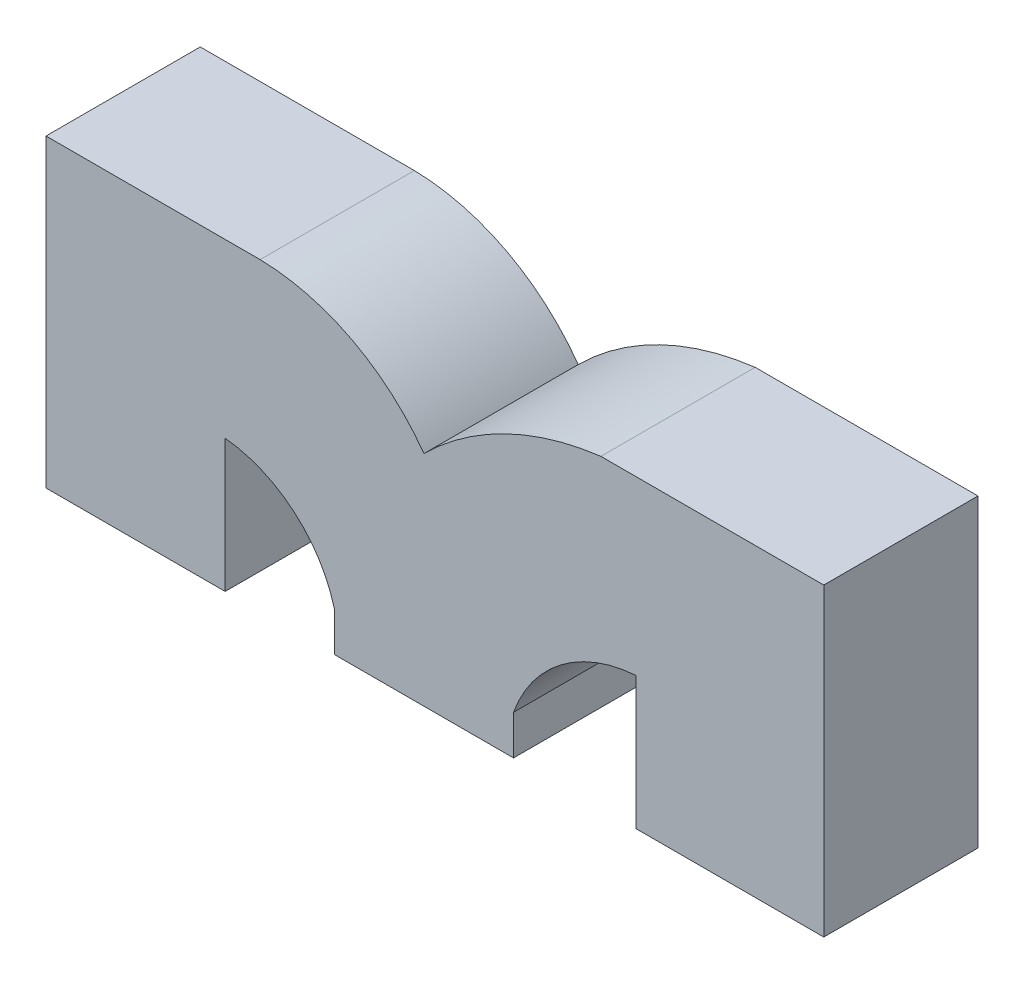
ISO-10303-21;
HEADER;
FILE_DESCRIPTION(('STEP AP214'),'2;1');
FILE_NAME('part.step','',(''),(''),'','','');
FILE_SCHEMA(('AUTOMOTIVE_DESIGN { 1 0 10303 214 1 1 1 1 }'));
ENDSEC;
DATA;
#1=APPLICATION_CONTEXT('core data for automotive mechanical design processes');
#2=APPLICATION_PROTOCOL_DEFINITION('international standard','automotive_design',2000,#1);
#3=PRODUCT_CONTEXT('',#1,'mechanical');
#4=PRODUCT('Part','Part','',(#3));
#5=PRODUCT_RELATED_PRODUCT_CATEGORY('part','',(#4));
#6=PRODUCT_DEFINITION_FORMATION('','',#4);
#7=PRODUCT_DEFINITION_CONTEXT('part definition',#1,'design');
#8=PRODUCT_DEFINITION('design','',#6,#7);
#9=PRODUCT_DEFINITION_SHAPE('','',#8);
#10=(LENGTH_UNIT() NAMED_UNIT(*) SI_UNIT(.MILLI.,.METRE.));
#11=(NAMED_UNIT(*) PLANE_ANGLE_UNIT() SI_UNIT($,.RADIAN.));
#12=(NAMED_UNIT(*) SI_UNIT($,.STERADIAN.) SOLID_ANGLE_UNIT());
#13=UNCERTAINTY_MEASURE_WITH_UNIT(LENGTH_MEASURE(1.E-05),#10,'distance_accuracy_value','');
#14=(GEOMETRIC_REPRESENTATION_CONTEXT(3) GLOBAL_UNCERTAINTY_ASSIGNED_CONTEXT((#13)) GLOBAL_UNIT_ASSIGNED_CONTEXT((#10,
#11,#12)) REPRESENTATION_CONTEXT('',''));
#15=CARTESIAN_POINT('',(0.,0.,0.));
#16=DIRECTION('',(0.,0.,1.));
#17=DIRECTION('',(1.,0.,0.));
#18=AXIS2_PLACEMENT_3D('',#15,#16,#17);
#19=CARTESIAN_POINT('',(-26.128211751492,6.131404155787,0.));
#20=DIRECTION('',(-1.,0.,0.));
#21=DIRECTION('',(0.,-1.,0.));
#22=AXIS2_PLACEMENT_3D('',#19,#20,#21);
#23=PLANE('',#22);
#24=DIRECTION('',(0.,-1.,0.));
#25=VECTOR('',#24,1.);
#26=CARTESIAN_POINT('',(-26.128211751492,6.131404155787,0.));
#27=LINE('',#26,#25);
#28=CARTESIAN_POINT('',(-26.128211751492,6.131404155787,0.));
#29=VERTEX_POINT('',#28);
#30=CARTESIAN_POINT('',(-26.128211751492,6.105766226117,0.));
#31=VERTEX_POINT('',#30);
#32=EDGE_CURVE('E11',#29,#31,#27,.T.);
#33=ORIENTED_EDGE('',*,*,#32,.T.);
#34=DIRECTION('',(0.,0.,1.));
#35=VECTOR('',#34,1.);
#36=CARTESIAN_POINT('',(-26.128211751492,6.105766226117,0.));
#37=LINE('',#36,#35);
#38=CARTESIAN_POINT('',(-26.128211751492,6.105766226117,0.1));
#39=VERTEX_POINT('',#38);
#40=EDGE_CURVE('E24',#31,#39,#37,.T.);
#41=ORIENTED_EDGE('',*,*,#40,.T.);
#42=DIRECTION('',(0.,-1.,0.));
#43=VECTOR('',#42,1.);
#44=CARTESIAN_POINT('',(-26.128211751492,6.131404155787,0.1));
#45=LINE('',#44,#43);
#46=CARTESIAN_POINT('',(-26.128211751492,6.131404155787,0.1));
#47=VERTEX_POINT('',#46);
#48=EDGE_CURVE('E142',#47,#39,#45,.T.);
#49=ORIENTED_EDGE('',*,*,#48,.F.);
#50=DIRECTION('',(0.,0.,1.));
#51=VECTOR('',#50,1.);
#52=CARTESIAN_POINT('',(-26.128211751492,6.131404155787,0.));
#53=LINE('',#52,#51);
#54=EDGE_CURVE('E250',#29,#47,#53,.T.);
#55=ORIENTED_EDGE('',*,*,#54,.F.);
#56=EDGE_LOOP('',(#33,#41,#49,#55));
#57=FACE_BOUND('',#56,.T.);
#58=ADVANCED_FACE('F17',(#57),#23,.T.);
#59=CARTESIAN_POINT('',(-26.207252238582,6.11043659046,0.));
#60=DIRECTION('',(0.,0.,1.));
#61=DIRECTION('',(-0.96656871015664,-0.256407738857723,0.));
#62=AXIS2_PLACEMENT_3D('',#59,#60,#61);
#63=CYLINDRICAL_SURFACE('',#62,0.0817743076716421);
#64=CARTESIAN_POINT('',(-26.207252238582,6.11043659046,0.));
#65=DIRECTION('',(0.,0.,-1.));
#66=DIRECTION('',(-0.96656871015664,-0.256407738857723,0.));
#67=AXIS2_PLACEMENT_3D('',#64,#65,#66);
#68=CIRCLE('',#67,0.0817743076716421);
#69=CARTESIAN_POINT('',(-26.199029290648,6.191796411763,0.));
#70=VERTEX_POINT('',#69);
#71=EDGE_CURVE('E247',#70,#29,#68,.T.);
#72=ORIENTED_EDGE('',*,*,#71,.T.);
#73=ORIENTED_EDGE('',*,*,#54,.T.);
#74=CARTESIAN_POINT('',(-26.207252238582,6.11043659046,0.1));
#75=DIRECTION('',(0.,0.,-1.));
#76=DIRECTION('',(-0.96656871015664,-0.256407738857723,0.));
#77=AXIS2_PLACEMENT_3D('',#74,#75,#76);
#78=CIRCLE('',#77,0.0817743076716421);
#79=CARTESIAN_POINT('',(-26.199029290648,6.191796411763,0.1));
#80=VERTEX_POINT('',#79);
#81=EDGE_CURVE('E245',#80,#47,#78,.T.);
#82=ORIENTED_EDGE('',*,*,#81,.F.);
#83=DIRECTION('',(0.,0.,1.));
#84=VECTOR('',#83,1.);
#85=CARTESIAN_POINT('',(-26.199029290648,6.191796411763,0.));
#86=LINE('',#85,#84);
#87=EDGE_CURVE('E243',#70,#80,#86,.T.);
#88=ORIENTED_EDGE('',*,*,#87,.F.);
#89=EDGE_LOOP('',(#72,#73,#82,#88));
#90=FACE_BOUND('',#89,.T.);
#91=ADVANCED_FACE('F289',(#90),#63,.F.);
#92=CARTESIAN_POINT('',(-26.199029290648,6.105766226117,0.));
#93=DIRECTION('',(1.,0.,0.));
#94=DIRECTION('',(0.,1.,0.));
#95=AXIS2_PLACEMENT_3D('',#92,#93,#94);
#96=PLANE('',#95);
#97=DIRECTION('',(0.,1.,0.));
#98=VECTOR('',#97,1.);
#99=CARTESIAN_POINT('',(-26.199029290648,6.105766226117,0.));
#100=LINE('',#99,#98);
#101=CARTESIAN_POINT('',(-26.199029290648,6.105766226117,0.));
#102=VERTEX_POINT('',#101);
#103=EDGE_CURVE('E240',#102,#70,#100,.T.);
#104=ORIENTED_EDGE('',*,*,#103,.T.);
#105=ORIENTED_EDGE('',*,*,#87,.T.);
#106=DIRECTION('',(0.,1.,0.));
#107=VECTOR('',#106,1.);
#108=CARTESIAN_POINT('',(-26.199029290648,6.105766226117,0.1));
#109=LINE('',#108,#107);
#110=CARTESIAN_POINT('',(-26.199029290648,6.105766226117,0.1));
#111=VERTEX_POINT('',#110);
#112=EDGE_CURVE('E237',#111,#80,#109,.T.);
#113=ORIENTED_EDGE('',*,*,#112,.F.);
#114=DIRECTION('',(0.,0.,1.));
#115=VECTOR('',#114,1.);
#116=CARTESIAN_POINT('',(-26.199029290648,6.105766226117,0.));
#117=LINE('',#116,#115);
#118=EDGE_CURVE('E234',#102,#111,#117,.T.);
#119=ORIENTED_EDGE('',*,*,#118,.F.);
#120=EDGE_LOOP('',(#104,#105,#113,#119));
#121=FACE_BOUND('',#120,.T.);
#122=ADVANCED_FACE('F287',(#121),#96,.T.);
#123=CARTESIAN_POINT('',(-26.315170054864,6.105766226117,0.));
#124=DIRECTION('',(0.,-1.,0.));
#125=DIRECTION('',(1.,0.,0.));
#126=AXIS2_PLACEMENT_3D('',#123,#124,#125);
#127=PLANE('',#126);
#128=DIRECTION('',(1.,0.,0.));
#129=VECTOR('',#128,1.);
#130=CARTESIAN_POINT('',(-26.315170054864,6.105766226117,0.));
#131=LINE('',#130,#129);
#132=CARTESIAN_POINT('',(-26.315170054864,6.105766226117,0.));
#133=VERTEX_POINT('',#132);
#134=EDGE_CURVE('E231',#133,#102,#131,.T.);
#135=ORIENTED_EDGE('',*,*,#134,.T.);
#136=ORIENTED_EDGE('',*,*,#118,.T.);
#137=DIRECTION('',(1.,0.,0.));
#138=VECTOR('',#137,1.);
#139=CARTESIAN_POINT('',(-26.315170054864,6.105766226117,0.1));
#140=LINE('',#139,#138);
#141=CARTESIAN_POINT('',(-26.315170054864,6.105766226117,0.1));
#142=VERTEX_POINT('',#141);
#143=EDGE_CURVE('E228',#142,#111,#140,.T.);
#144=ORIENTED_EDGE('',*,*,#143,.F.);
#145=DIRECTION('',(0.,0.,1.));
#146=VECTOR('',#145,1.);
#147=CARTESIAN_POINT('',(-26.315170054864,6.105766226117,0.));
#148=LINE('',#147,#146);
#149=EDGE_CURVE('E225',#133,#142,#148,.T.);
#150=ORIENTED_EDGE('',*,*,#149,.F.);
#151=EDGE_LOOP('',(#135,#136,#144,#150));
#152=FACE_BOUND('',#151,.T.);
#153=ADVANCED_FACE('F283',(#152),#127,.T.);
#154=CARTESIAN_POINT('',(-26.315170054864,6.30342142889,0.));
#155=DIRECTION('',(-1.,0.,0.));
#156=DIRECTION('',(0.,-1.,0.));
#157=AXIS2_PLACEMENT_3D('',#154,#155,#156);
#158=PLANE('',#157);
#159=DIRECTION('',(0.,-1.,0.));
#160=VECTOR('',#159,1.);
#161=CARTESIAN_POINT('',(-26.315170054864,6.30342142889,0.));
#162=LINE('',#161,#160);
#163=CARTESIAN_POINT('',(-26.315170054864,6.30342142889,0.));
#164=VERTEX_POINT('',#163);
#165=EDGE_CURVE('E222',#164,#133,#162,.T.);
#166=ORIENTED_EDGE('',*,*,#165,.T.);
#167=ORIENTED_EDGE('',*,*,#149,.T.);
#168=DIRECTION('',(0.,-1.,0.));
#169=VECTOR('',#168,1.);
#170=CARTESIAN_POINT('',(-26.315170054864,6.30342142889,0.1));
#171=LINE('',#170,#169);
#172=CARTESIAN_POINT('',(-26.315170054864,6.30342142889,0.1));
#173=VERTEX_POINT('',#172);
#174=EDGE_CURVE('E219',#173,#142,#171,.T.);
#175=ORIENTED_EDGE('',*,*,#174,.F.);
#176=DIRECTION('',(0.,0.,1.));
#177=VECTOR('',#176,1.);
#178=CARTESIAN_POINT('',(-26.315170054864,6.30342142889,0.));
#179=LINE('',#178,#177);
#180=EDGE_CURVE('E216',#164,#173,#179,.T.);
#181=ORIENTED_EDGE('',*,*,#180,.F.);
#182=EDGE_LOOP('',(#166,#167,#175,#181));
#183=FACE_BOUND('',#182,.T.);
#184=ADVANCED_FACE('F280',(#183),#158,.T.);
#185=CARTESIAN_POINT('',(-26.176367678118,6.30342142889,0.));
#186=DIRECTION('',(0.,1.,0.));
#187=DIRECTION('',(-1.,0.,0.));
#188=AXIS2_PLACEMENT_3D('',#185,#186,#187);
#189=PLANE('',#188);
#190=DIRECTION('',(-1.,0.,0.));
#191=VECTOR('',#190,1.);
#192=CARTESIAN_POINT('',(-26.176367678118,6.30342142889,0.));
#193=LINE('',#192,#191);
#194=CARTESIAN_POINT('',(-26.176367678118,6.30342142889,0.));
#195=VERTEX_POINT('',#194);
#196=EDGE_CURVE('E213',#195,#164,#193,.T.);
#197=ORIENTED_EDGE('',*,*,#196,.T.);
#198=ORIENTED_EDGE('',*,*,#180,.T.);
#199=DIRECTION('',(-1.,0.,0.));
#200=VECTOR('',#199,1.);
#201=CARTESIAN_POINT('',(-26.176367678118,6.30342142889,0.1));
#202=LINE('',#201,#200);
#203=CARTESIAN_POINT('',(-26.176367678118,6.30342142889,0.1));
#204=VERTEX_POINT('',#203);
#205=EDGE_CURVE('E210',#204,#173,#202,.T.);
#206=ORIENTED_EDGE('',*,*,#205,.F.);
#207=DIRECTION('',(0.,0.,1.));
#208=VECTOR('',#207,1.);
#209=CARTESIAN_POINT('',(-26.176367678118,6.30342142889,0.));
#210=LINE('',#209,#208);
#211=EDGE_CURVE('E207',#195,#204,#210,.T.);
#212=ORIENTED_EDGE('',*,*,#211,.F.);
#213=EDGE_LOOP('',(#197,#198,#206,#212));
#214=FACE_BOUND('',#213,.T.);
#215=ADVANCED_FACE('F277',(#214),#189,.T.);
#216=CARTESIAN_POINT('',(-26.178825059013,6.169749406555,0.));
#217=DIRECTION('',(0.,0.,1.));
#218=DIRECTION('',(0.812925001603613,0.582368390082915,0.));
#219=AXIS2_PLACEMENT_3D('',#216,#217,#218);
#220=CYLINDRICAL_SURFACE('',#219,0.133694608253058);
#221=CARTESIAN_POINT('',(-26.178825059013,6.169749406555,0.));
#222=DIRECTION('',(0.,0.,1.));
#223=DIRECTION('',(0.812925001603613,0.582368390082915,0.));
#224=AXIS2_PLACEMENT_3D('',#221,#222,#223);
#225=CIRCLE('',#224,0.133694608253058);
#226=CARTESIAN_POINT('',(-26.070141369385,6.247608920327,0.));
#227=VERTEX_POINT('',#226);
#228=EDGE_CURVE('E204',#227,#195,#225,.T.);
#229=ORIENTED_EDGE('',*,*,#228,.T.);
#230=ORIENTED_EDGE('',*,*,#211,.T.);
#231=CARTESIAN_POINT('',(-26.178825059013,6.169749406555,0.1));
#232=DIRECTION('',(0.,0.,1.));
#233=DIRECTION('',(0.812925001603613,0.582368390082915,0.));
#234=AXIS2_PLACEMENT_3D('',#231,#232,#233);
#235=CIRCLE('',#234,0.133694608253058);
#236=CARTESIAN_POINT('',(-26.070141369385,6.247608920327,0.1));
#237=VERTEX_POINT('',#236);
#238=EDGE_CURVE('E201',#237,#204,#235,.T.);
#239=ORIENTED_EDGE('',*,*,#238,.F.);
#240=DIRECTION('',(0.,0.,1.));
#241=VECTOR('',#240,1.);
#242=CARTESIAN_POINT('',(-26.070141369385,6.247608920327,0.));
#243=LINE('',#242,#241);
#244=EDGE_CURVE('E198',#227,#237,#243,.T.);
#245=ORIENTED_EDGE('',*,*,#244,.F.);
#246=EDGE_LOOP('',(#229,#230,#239,#245));
#247=FACE_BOUND('',#246,.T.);
#248=ADVANCED_FACE('F274',(#247),#220,.T.);
#249=CARTESIAN_POINT('',(-25.931506084624,6.108455738535,0.));
#250=DIRECTION('',(0.,0.,1.));
#251=DIRECTION('',(-0.121729387015494,0.992563326109137,0.));
#252=AXIS2_PLACEMENT_3D('',#249,#250,#251);
#253=CYLINDRICAL_SURFACE('',#252,0.196426449806513);
#254=CARTESIAN_POINT('',(-25.931506084624,6.108455738535,0.));
#255=DIRECTION('',(0.,0.,1.));
#256=DIRECTION('',(-0.121729387015494,0.992563326109137,0.));
#257=AXIS2_PLACEMENT_3D('',#254,#255,#256);
#258=CIRCLE('',#257,0.196426449806513);
#259=CARTESIAN_POINT('',(-25.955416955952,6.30342142889,0.));
#260=VERTEX_POINT('',#259);
#261=EDGE_CURVE('E195',#260,#227,#258,.T.);
#262=ORIENTED_EDGE('',*,*,#261,.T.);
#263=ORIENTED_EDGE('',*,*,#244,.T.);
#264=CARTESIAN_POINT('',(-25.931506084624,6.108455738535,0.1));
#265=DIRECTION('',(0.,0.,1.));
#266=DIRECTION('',(-0.121729387015494,0.992563326109137,0.));
#267=AXIS2_PLACEMENT_3D('',#264,#265,#266);
#268=CIRCLE('',#267,0.196426449806513);
#269=CARTESIAN_POINT('',(-25.955416955952,6.30342142889,0.1));
#270=VERTEX_POINT('',#269);
#271=EDGE_CURVE('E192',#270,#237,#268,.T.);
#272=ORIENTED_EDGE('',*,*,#271,.F.);
#273=DIRECTION('',(0.,0.,1.));
#274=VECTOR('',#273,1.);
#275=CARTESIAN_POINT('',(-25.955416955952,6.30342142889,0.));
#276=LINE('',#275,#274);
#277=EDGE_CURVE('E189',#260,#270,#276,.T.);
#278=ORIENTED_EDGE('',*,*,#277,.F.);
#279=EDGE_LOOP('',(#262,#263,#272,#278));
#280=FACE_BOUND('',#279,.T.);
#281=ADVANCED_FACE('F271',(#280),#253,.T.);
#282=CARTESIAN_POINT('',(-25.810949176075,6.30342142889,0.));
#283=DIRECTION('',(0.,1.,0.));
#284=DIRECTION('',(-1.,0.,0.));
#285=AXIS2_PLACEMENT_3D('',#282,#283,#284);
#286=PLANE('',#285);
#287=DIRECTION('',(-1.,0.,0.));
#288=VECTOR('',#287,1.);
#289=CARTESIAN_POINT('',(-25.810949176075,6.30342142889,0.));
#290=LINE('',#289,#288);
#291=CARTESIAN_POINT('',(-25.810949176075,6.30342142889,0.));
#292=VERTEX_POINT('',#291);
#293=EDGE_CURVE('E186',#292,#260,#290,.T.);
#294=ORIENTED_EDGE('',*,*,#293,.T.);
#295=ORIENTED_EDGE('',*,*,#277,.T.);
#296=DIRECTION('',(-1.,0.,0.));
#297=VECTOR('',#296,1.);
#298=CARTESIAN_POINT('',(-25.810949176075,6.30342142889,0.1));
#299=LINE('',#298,#297);
#300=CARTESIAN_POINT('',(-25.810949176075,6.30342142889,0.1));
#301=VERTEX_POINT('',#300);
#302=EDGE_CURVE('E183',#301,#270,#299,.T.);
#303=ORIENTED_EDGE('',*,*,#302,.F.);
#304=DIRECTION('',(0.,0.,1.));
#305=VECTOR('',#304,1.);
#306=CARTESIAN_POINT('',(-25.810949176075,6.30342142889,0.));
#307=LINE('',#306,#305);
#308=EDGE_CURVE('E180',#292,#301,#307,.T.);
#309=ORIENTED_EDGE('',*,*,#308,.F.);
#310=EDGE_LOOP('',(#294,#295,#303,#309));
#311=FACE_BOUND('',#310,.T.);
#312=ADVANCED_FACE('F268',(#311),#286,.T.);
#313=CARTESIAN_POINT('',(-25.810949176075,6.105766226117,0.));
#314=DIRECTION('',(1.,0.,0.));
#315=DIRECTION('',(0.,1.,0.));
#316=AXIS2_PLACEMENT_3D('',#313,#314,#315);
#317=PLANE('',#316);
#318=DIRECTION('',(0.,1.,0.));
#319=VECTOR('',#318,1.);
#320=CARTESIAN_POINT('',(-25.810949176075,6.105766226117,0.));
#321=LINE('',#320,#319);
#322=CARTESIAN_POINT('',(-25.810949176075,6.105766226117,0.));
#323=VERTEX_POINT('',#322);
#324=EDGE_CURVE('E177',#323,#292,#321,.T.);
#325=ORIENTED_EDGE('',*,*,#324,.T.);
#326=ORIENTED_EDGE('',*,*,#308,.T.);
#327=DIRECTION('',(0.,1.,0.));
#328=VECTOR('',#327,1.);
#329=CARTESIAN_POINT('',(-25.810949176075,6.105766226117,0.1));
#330=LINE('',#329,#328);
#331=CARTESIAN_POINT('',(-25.810949176075,6.105766226117,0.1));
#332=VERTEX_POINT('',#331);
#333=EDGE_CURVE('E174',#332,#301,#330,.T.);
#334=ORIENTED_EDGE('',*,*,#333,.F.);
#335=DIRECTION('',(0.,0.,1.));
#336=VECTOR('',#335,1.);
#337=CARTESIAN_POINT('',(-25.810949176075,6.105766226117,0.));
#338=LINE('',#337,#336);
#339=EDGE_CURVE('E171',#323,#332,#338,.T.);
#340=ORIENTED_EDGE('',*,*,#339,.F.);
#341=EDGE_LOOP('',(#325,#326,#334,#340));
#342=FACE_BOUND('',#341,.T.);
#343=ADVANCED_FACE('F265',(#342),#317,.T.);
#344=CARTESIAN_POINT('',(-25.932755343422,6.105766226117,0.));
#345=DIRECTION('',(0.,-1.,0.));
#346=DIRECTION('',(1.,0.,0.));
#347=AXIS2_PLACEMENT_3D('',#344,#345,#346);
#348=PLANE('',#347);
#349=DIRECTION('',(1.,0.,0.));
#350=VECTOR('',#349,1.);
#351=CARTESIAN_POINT('',(-25.932755343422,6.105766226117,0.));
#352=LINE('',#351,#350);
#353=CARTESIAN_POINT('',(-25.932755343422,6.105766226117,0.));
#354=VERTEX_POINT('',#353);
#355=EDGE_CURVE('E168',#354,#323,#352,.T.);
#356=ORIENTED_EDGE('',*,*,#355,.T.);
#357=ORIENTED_EDGE('',*,*,#339,.T.);
#358=DIRECTION('',(1.,0.,0.));
#359=VECTOR('',#358,1.);
#360=CARTESIAN_POINT('',(-25.932755343422,6.105766226117,0.1));
#361=LINE('',#360,#359);
#362=CARTESIAN_POINT('',(-25.932755343422,6.105766226117,0.1));
#363=VERTEX_POINT('',#362);
#364=EDGE_CURVE('E165',#363,#332,#361,.T.);
#365=ORIENTED_EDGE('',*,*,#364,.F.);
#366=DIRECTION('',(0.,0.,1.));
#367=VECTOR('',#366,1.);
#368=CARTESIAN_POINT('',(-25.932755343422,6.105766226117,0.));
#369=LINE('',#368,#367);
#370=EDGE_CURVE('E162',#354,#363,#369,.T.);
#371=ORIENTED_EDGE('',*,*,#370,.F.);
#372=EDGE_LOOP('',(#356,#357,#365,#371));
#373=FACE_BOUND('',#372,.T.);
#374=ADVANCED_FACE('F262',(#373),#348,.T.);
#375=CARTESIAN_POINT('',(-25.932755343422,6.191796411763,0.));
#376=DIRECTION('',(-1.,0.,0.));
#377=DIRECTION('',(0.,-1.,0.));
#378=AXIS2_PLACEMENT_3D('',#375,#376,#377);
#379=PLANE('',#378);
#380=DIRECTION('',(0.,-1.,0.));
#381=VECTOR('',#380,1.);
#382=CARTESIAN_POINT('',(-25.932755343422,6.191796411763,0.));
#383=LINE('',#382,#381);
#384=CARTESIAN_POINT('',(-25.932755343422,6.191796411763,0.));
#385=VERTEX_POINT('',#384);
#386=EDGE_CURVE('E159',#385,#354,#383,.T.);
#387=ORIENTED_EDGE('',*,*,#386,.T.);
#388=ORIENTED_EDGE('',*,*,#370,.T.);
#389=DIRECTION('',(0.,-1.,0.));
#390=VECTOR('',#389,1.);
#391=CARTESIAN_POINT('',(-25.932755343422,6.191796411763,0.1));
#392=LINE('',#391,#390);
#393=CARTESIAN_POINT('',(-25.932755343422,6.191796411763,0.1));
#394=VERTEX_POINT('',#393);
#395=EDGE_CURVE('E156',#394,#363,#392,.T.);
#396=ORIENTED_EDGE('',*,*,#395,.F.);
#397=DIRECTION('',(0.,0.,1.));
#398=VECTOR('',#397,1.);
#399=CARTESIAN_POINT('',(-25.932755343422,6.191796411763,0.));
#400=LINE('',#399,#398);
#401=EDGE_CURVE('E153',#385,#394,#400,.T.);
#402=ORIENTED_EDGE('',*,*,#401,.F.);
#403=EDGE_LOOP('',(#387,#388,#396,#402));
#404=FACE_BOUND('',#403,.T.);
#405=ADVANCED_FACE('F259',(#404),#379,.T.);
#406=CARTESIAN_POINT('',(-25.926090423449,6.100762713799,0.));
#407=DIRECTION('',(0.,0.,1.));
#408=DIRECTION('',(0.07301833032271,-0.997330598867238,0.));
#409=AXIS2_PLACEMENT_3D('',#406,#407,#408);
#410=CYLINDRICAL_SURFACE('',#409,0.0912773538356099);
#411=CARTESIAN_POINT('',(-25.926090423449,6.100762713799,0.));
#412=DIRECTION('',(0.,0.,-1.));
#413=DIRECTION('',(0.07301833032271,-0.997330598867238,0.));
#414=AXIS2_PLACEMENT_3D('',#411,#412,#413);
#415=CIRCLE('',#414,0.0912773538356099);
#416=CARTESIAN_POINT('',(-26.012070987277,6.131404155787,0.));
#417=VERTEX_POINT('',#416);
#418=EDGE_CURVE('E150',#417,#385,#415,.T.);
#419=ORIENTED_EDGE('',*,*,#418,.T.);
#420=ORIENTED_EDGE('',*,*,#401,.T.);
#421=CARTESIAN_POINT('',(-25.926090423449,6.100762713799,0.1));
#422=DIRECTION('',(0.,0.,-1.));
#423=DIRECTION('',(0.07301833032271,-0.997330598867238,0.));
#424=AXIS2_PLACEMENT_3D('',#421,#422,#423);
#425=CIRCLE('',#424,0.0912773538356099);
#426=CARTESIAN_POINT('',(-26.012070987277,6.131404155787,0.1));
#427=VERTEX_POINT('',#426);
#428=EDGE_CURVE('E148',#427,#394,#425,.T.);
#429=ORIENTED_EDGE('',*,*,#428,.F.);
#430=DIRECTION('',(0.,0.,1.));
#431=VECTOR('',#430,1.);
#432=CARTESIAN_POINT('',(-26.012070987277,6.131404155787,0.));
#433=LINE('',#432,#431);
#434=EDGE_CURVE('E126',#417,#427,#433,.T.);
#435=ORIENTED_EDGE('',*,*,#434,.F.);
#436=EDGE_LOOP('',(#419,#420,#429,#435));
#437=FACE_BOUND('',#436,.T.);
#438=ADVANCED_FACE('F257',(#437),#410,.F.);
#439=CARTESIAN_POINT('',(-26.012070987277,6.105766226117,0.));
#440=DIRECTION('',(1.,0.,0.));
#441=DIRECTION('',(0.,1.,0.));
#442=AXIS2_PLACEMENT_3D('',#439,#440,#441);
#443=PLANE('',#442);
#444=DIRECTION('',(0.,1.,0.));
#445=VECTOR('',#444,1.);
#446=CARTESIAN_POINT('',(-26.012070987277,6.105766226117,0.));
#447=LINE('',#446,#445);
#448=CARTESIAN_POINT('',(-26.012070987277,6.105766226117,0.));
#449=VERTEX_POINT('',#448);
#450=EDGE_CURVE('E131',#449,#417,#447,.T.);
#451=ORIENTED_EDGE('',*,*,#450,.T.);
#452=ORIENTED_EDGE('',*,*,#434,.T.);
#453=DIRECTION('',(0.,1.,0.));
#454=VECTOR('',#453,1.);
#455=CARTESIAN_POINT('',(-26.012070987277,6.105766226117,0.1));
#456=LINE('',#455,#454);
#457=CARTESIAN_POINT('',(-26.012070987277,6.105766226117,0.1));
#458=VERTEX_POINT('',#457);
#459=EDGE_CURVE('E120',#458,#427,#456,.T.);
#460=ORIENTED_EDGE('',*,*,#459,.F.);
#461=DIRECTION('',(0.,0.,1.));
#462=VECTOR('',#461,1.);
#463=CARTESIAN_POINT('',(-26.012070987277,6.105766226117,0.));
#464=LINE('',#463,#462);
#465=EDGE_CURVE('E124',#449,#458,#464,.T.);
#466=ORIENTED_EDGE('',*,*,#465,.F.);
#467=EDGE_LOOP('',(#451,#452,#460,#466));
#468=FACE_BOUND('',#467,.T.);
#469=ADVANCED_FACE('F123',(#468),#443,.T.);
#470=CARTESIAN_POINT('',(-26.128211751492,6.105766226117,0.));
#471=DIRECTION('',(0.,-1.,0.));
#472=DIRECTION('',(1.,0.,0.));
#473=AXIS2_PLACEMENT_3D('',#470,#471,#472);
#474=PLANE('',#473);
#475=DIRECTION('',(1.,0.,0.));
#476=VECTOR('',#475,1.);
#477=CARTESIAN_POINT('',(-26.128211751492,6.105766226117,0.));
#478=LINE('',#477,#476);
#479=EDGE_CURVE('E137',#31,#449,#478,.T.);
#480=ORIENTED_EDGE('',*,*,#479,.T.);
#481=ORIENTED_EDGE('',*,*,#465,.T.);
#482=DIRECTION('',(1.,0.,0.));
#483=VECTOR('',#482,1.);
#484=CARTESIAN_POINT('',(-26.128211751492,6.105766226117,0.1));
#485=LINE('',#484,#483);
#486=EDGE_CURVE('E136',#39,#458,#485,.T.);
#487=ORIENTED_EDGE('',*,*,#486,.F.);
#488=ORIENTED_EDGE('',*,*,#40,.F.);
#489=EDGE_LOOP('',(#480,#481,#487,#488));
#490=FACE_BOUND('',#489,.T.);
#491=ADVANCED_FACE('F135',(#490),#474,.T.);
#492=CARTESIAN_POINT('',(-26.063814053481,6.197399744498,0.1));
#493=DIRECTION('',(0.,0.,1.));
#494=DIRECTION('',(1.,0.,0.));
#495=AXIS2_PLACEMENT_3D('',#492,#493,#494);
#496=PLANE('',#495);
#497=ORIENTED_EDGE('',*,*,#486,.T.);
#498=ORIENTED_EDGE('',*,*,#459,.T.);
#499=ORIENTED_EDGE('',*,*,#428,.T.);
#500=ORIENTED_EDGE('',*,*,#395,.T.);
#501=ORIENTED_EDGE('',*,*,#364,.T.);
#502=ORIENTED_EDGE('',*,*,#333,.T.);
#503=ORIENTED_EDGE('',*,*,#302,.T.);
#504=ORIENTED_EDGE('',*,*,#271,.T.);
#505=ORIENTED_EDGE('',*,*,#238,.T.);
#506=ORIENTED_EDGE('',*,*,#205,.T.);
#507=ORIENTED_EDGE('',*,*,#174,.T.);
#508=ORIENTED_EDGE('',*,*,#143,.T.);
#509=ORIENTED_EDGE('',*,*,#112,.T.);
#510=ORIENTED_EDGE('',*,*,#81,.T.);
#511=ORIENTED_EDGE('',*,*,#48,.T.);
#512=EDGE_LOOP('',(#497,#498,#499,#500,#501,#502,#503,#504,#505,#506,#507,#508,#509,#510,#511));
#513=FACE_BOUND('',#512,.T.);
#514=ADVANCED_FACE('F140',(#513),#496,.T.);
#515=CARTESIAN_POINT('',(-26.063814053481,6.197399744498,0.));
#516=DIRECTION('',(0.,0.,1.));
#517=DIRECTION('',(1.,0.,0.));
#518=AXIS2_PLACEMENT_3D('',#515,#516,#517);
#519=PLANE('',#518);
#520=ORIENTED_EDGE('',*,*,#479,.F.);
#521=ORIENTED_EDGE('',*,*,#32,.F.);
#522=ORIENTED_EDGE('',*,*,#71,.F.);
#523=ORIENTED_EDGE('',*,*,#103,.F.);
#524=ORIENTED_EDGE('',*,*,#134,.F.);
#525=ORIENTED_EDGE('',*,*,#165,.F.);
#526=ORIENTED_EDGE('',*,*,#196,.F.);
#527=ORIENTED_EDGE('',*,*,#228,.F.);
#528=ORIENTED_EDGE('',*,*,#261,.F.);
#529=ORIENTED_EDGE('',*,*,#293,.F.);
#530=ORIENTED_EDGE('',*,*,#324,.F.);
#531=ORIENTED_EDGE('',*,*,#355,.F.);
#532=ORIENTED_EDGE('',*,*,#386,.F.);
#533=ORIENTED_EDGE('',*,*,#418,.F.);
#534=ORIENTED_EDGE('',*,*,#450,.F.);
#535=EDGE_LOOP('',(#520,#521,#522,#523,#524,#525,#526,#527,#528,#529,#530,#531,#532,#533,#534));
#536=FACE_BOUND('',#535,.T.);
#537=ADVANCED_FACE('F253',(#536),#519,.F.);
#538=CLOSED_SHELL('',(#58,#91,#122,#153,#184,#215,#248,#281,#312,#343,#374,#405,#438,#469,#491,
#514,#537));
#539=MANIFOLD_SOLID_BREP('B1',#538);
#540=ADVANCED_BREP_SHAPE_REPRESENTATION('',(#18,#539),#14);
#541=SHAPE_DEFINITION_REPRESENTATION(#9,#540);
ENDSEC;
END-ISO-10303-21;
